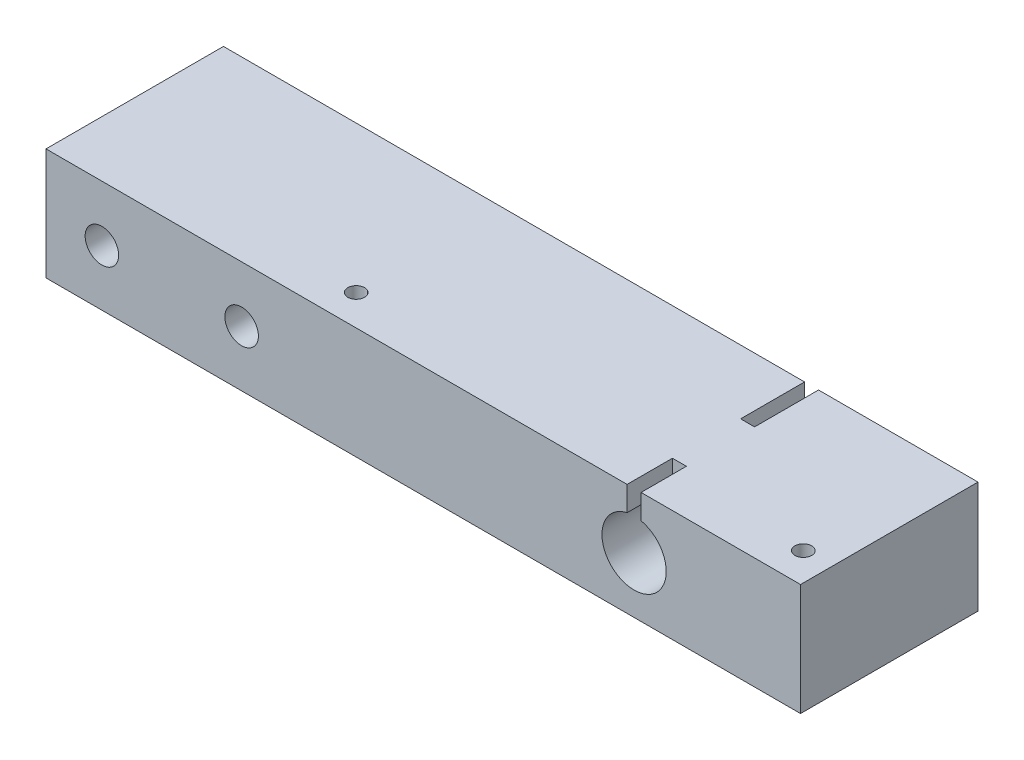
ISO-10303-21;
HEADER;
FILE_DESCRIPTION(('STEP AP214'),'2;1');
FILE_NAME('part.step','',(''),(''),'','','');
FILE_SCHEMA(('AUTOMOTIVE_DESIGN { 1 0 10303 214 1 1 1 1 }'));
ENDSEC;
DATA;
#1=APPLICATION_CONTEXT('core data for automotive mechanical design processes');
#2=APPLICATION_PROTOCOL_DEFINITION('international standard','automotive_design',2000,#1);
#3=PRODUCT_CONTEXT('',#1,'mechanical');
#4=PRODUCT('Part','Part','',(#3));
#5=PRODUCT_RELATED_PRODUCT_CATEGORY('part','',(#4));
#6=PRODUCT_DEFINITION_FORMATION('','',#4);
#7=PRODUCT_DEFINITION_CONTEXT('part definition',#1,'design');
#8=PRODUCT_DEFINITION('design','',#6,#7);
#9=PRODUCT_DEFINITION_SHAPE('','',#8);
#10=(LENGTH_UNIT() NAMED_UNIT(*) SI_UNIT(.MILLI.,.METRE.));
#11=(NAMED_UNIT(*) PLANE_ANGLE_UNIT() SI_UNIT($,.RADIAN.));
#12=(NAMED_UNIT(*) SI_UNIT($,.STERADIAN.) SOLID_ANGLE_UNIT());
#13=UNCERTAINTY_MEASURE_WITH_UNIT(LENGTH_MEASURE(1.E-05),#10,'distance_accuracy_value','');
#14=(GEOMETRIC_REPRESENTATION_CONTEXT(3) GLOBAL_UNCERTAINTY_ASSIGNED_CONTEXT((#13)) GLOBAL_UNIT_ASSIGNED_CONTEXT((#10,
#11,#12)) REPRESENTATION_CONTEXT('',''));
#15=CARTESIAN_POINT('',(0.,0.,0.));
#16=DIRECTION('',(0.,0.,1.));
#17=DIRECTION('',(1.,0.,0.));
#18=AXIS2_PLACEMENT_3D('',#15,#16,#17);
#19=CARTESIAN_POINT('',(42.0877150460028,4.,0.));
#20=DIRECTION('',(0.,0.,1.));
#21=DIRECTION('',(1.,0.,0.));
#22=AXIS2_PLACEMENT_3D('',#19,#20,#21);
#23=CYLINDRICAL_SURFACE('',#22,2.30000000000001);
#24=CARTESIAN_POINT('',(42.0877150460028,4.,0.));
#25=DIRECTION('',(0.,0.,1.));
#26=DIRECTION('',(1.,0.,0.));
#27=AXIS2_PLACEMENT_3D('',#24,#25,#26);
#28=CIRCLE('',#27,2.30000000000001);
#29=CARTESIAN_POINT('',(44.3094541764376,4.59487413483434,0.));
#30=VERTEX_POINT('',#29);
#31=CARTESIAN_POINT('',(42.5877150460028,6.24499443206437,0.));
#32=VERTEX_POINT('',#31);
#33=EDGE_CURVE('E158',#30,#32,#28,.T.);
#34=ORIENTED_EDGE('',*,*,#33,.F.);
#35=DIRECTION('',(0.,0.,-1.));
#36=VECTOR('',#35,1.);
#37=CARTESIAN_POINT('',(44.3094541764376,4.59487413483434,3.));
#38=LINE('',#37,#36);
#39=CARTESIAN_POINT('',(44.3094541764376,4.59487413483434,6.));
#40=VERTEX_POINT('',#39);
#41=EDGE_CURVE('E62',#30,#40,#38,.F.);
#42=ORIENTED_EDGE('',*,*,#41,.T.);
#43=CARTESIAN_POINT('',(42.0877150460028,4.,6.));
#44=DIRECTION('',(0.,0.,-1.));
#45=DIRECTION('',(-1.,0.,0.));
#46=AXIS2_PLACEMENT_3D('',#43,#44,#45);
#47=CIRCLE('',#46,2.30000000000001);
#48=CARTESIAN_POINT('',(44.3094541764376,3.40512586516567,6.));
#49=VERTEX_POINT('',#48);
#50=EDGE_CURVE('E14',#49,#40,#47,.F.);
#51=ORIENTED_EDGE('',*,*,#50,.F.);
#52=DIRECTION('',(0.,0.,-1.));
#53=VECTOR('',#52,1.);
#54=CARTESIAN_POINT('',(44.3094541764376,3.40512586516567,3.));
#55=LINE('',#54,#53);
#56=CARTESIAN_POINT('',(44.3094541764376,3.40512586516567,0.));
#57=VERTEX_POINT('',#56);
#58=EDGE_CURVE('E153',#49,#57,#55,.T.);
#59=ORIENTED_EDGE('',*,*,#58,.T.);
#60=CARTESIAN_POINT('',(41.5877150460028,6.24499443206437,0.));
#61=VERTEX_POINT('',#60);
#62=EDGE_CURVE('E193',#61,#57,#28,.T.);
#63=ORIENTED_EDGE('',*,*,#62,.F.);
#64=DIRECTION('',(0.,0.,1.));
#65=VECTOR('',#64,1.);
#66=CARTESIAN_POINT('',(41.5877150460028,6.24499443206437,0.));
#67=LINE('',#66,#65);
#68=CARTESIAN_POINT('',(41.5877150460028,6.24499443206437,4.57737416325741));
#69=VERTEX_POINT('',#68);
#70=EDGE_CURVE('E55',#69,#61,#67,.F.);
#71=ORIENTED_EDGE('',*,*,#70,.F.);
#72=CARTESIAN_POINT('',(42.0877150460028,4.,4.57737416325741));
#73=DIRECTION('',(0.,0.,1.));
#74=DIRECTION('',(1.,0.,0.));
#75=AXIS2_PLACEMENT_3D('',#72,#73,#74);
#76=CIRCLE('',#75,2.30000000000001);
#77=CARTESIAN_POINT('',(42.5877150460028,6.24499443206437,4.57737416325741));
#78=VERTEX_POINT('',#77);
#79=EDGE_CURVE('E196',#78,#69,#76,.T.);
#80=ORIENTED_EDGE('',*,*,#79,.F.);
#81=DIRECTION('',(0.,0.,1.));
#82=VECTOR('',#81,1.);
#83=CARTESIAN_POINT('',(42.5877150460028,6.24499443206437,0.));
#84=LINE('',#83,#82);
#85=EDGE_CURVE('E200',#32,#78,#84,.T.);
#86=ORIENTED_EDGE('',*,*,#85,.F.);
#87=EDGE_LOOP('',(#34,#42,#51,#59,#63,#71,#80,#86));
#88=FACE_BOUND('',#87,.T.);
#89=CARTESIAN_POINT('',(42.0877150460028,4.,9.45688860373222));
#90=DIRECTION('',(0.,0.,-1.));
#91=DIRECTION('',(-1.,0.,0.));
#92=AXIS2_PLACEMENT_3D('',#89,#90,#91);
#93=CIRCLE('',#92,2.30000000000001);
#94=CARTESIAN_POINT('',(41.5877150460028,6.24499443206437,9.45688860373222));
#95=VERTEX_POINT('',#94);
#96=CARTESIAN_POINT('',(42.5877150460028,6.24499443206437,9.45688860373222));
#97=VERTEX_POINT('',#96);
#98=EDGE_CURVE('E203',#95,#97,#93,.T.);
#99=ORIENTED_EDGE('',*,*,#98,.F.);
#100=DIRECTION('',(0.,0.,1.));
#101=VECTOR('',#100,1.);
#102=CARTESIAN_POINT('',(41.5877150460028,6.24499443206437,0.));
#103=LINE('',#102,#101);
#104=CARTESIAN_POINT('',(41.5877150460028,6.24499443206437,12.7));
#105=VERTEX_POINT('',#104);
#106=EDGE_CURVE('E205',#105,#95,#103,.F.);
#107=ORIENTED_EDGE('',*,*,#106,.F.);
#108=CARTESIAN_POINT('',(42.0877150460028,4.,12.7));
#109=DIRECTION('',(0.,0.,1.));
#110=DIRECTION('',(1.,0.,0.));
#111=AXIS2_PLACEMENT_3D('',#108,#109,#110);
#112=CIRCLE('',#111,2.30000000000001);
#113=CARTESIAN_POINT('',(42.5877150460028,6.24499443206437,12.7));
#114=VERTEX_POINT('',#113);
#115=EDGE_CURVE('E190',#105,#114,#112,.T.);
#116=ORIENTED_EDGE('',*,*,#115,.T.);
#117=DIRECTION('',(0.,0.,1.));
#118=VECTOR('',#117,1.);
#119=CARTESIAN_POINT('',(42.5877150460028,6.24499443206437,0.));
#120=LINE('',#119,#118);
#121=EDGE_CURVE('E70',#97,#114,#120,.T.);
#122=ORIENTED_EDGE('',*,*,#121,.F.);
#123=EDGE_LOOP('',(#99,#107,#116,#122));
#124=FACE_BOUND('',#123,.T.);
#125=CARTESIAN_POINT('',(39.7877150460028,4.,5.72581653929576));
#126=CARTESIAN_POINT('',(39.7877162855899,4.02508629398581,5.72582279978734));
#127=CARTESIAN_POINT('',(39.7881325445039,4.05022364496779,5.72836793099366));
#128=CARTESIAN_POINT('',(39.7897363960611,4.09954785879975,5.73826435373935));
#129=CARTESIAN_POINT('',(39.7909267823017,4.12373094141218,5.74563305275077));
#130=CARTESIAN_POINT('',(39.7938996772061,4.1701369460105,5.7643157614751));
#131=CARTESIAN_POINT('',(39.7956754805926,4.19237861407067,5.77558516300361));
#132=CARTESIAN_POINT('',(39.7996410231373,4.23489123086901,5.80125133077443));
#133=CARTESIAN_POINT('',(39.8018307377943,4.25516229614781,5.81564791191357));
#134=CARTESIAN_POINT('',(39.8077852424093,4.30471866888132,5.85577320402261));
#135=CARTESIAN_POINT('',(39.8117353214633,4.33253973972503,5.88327790078935));
#136=CARTESIAN_POINT('',(39.8197783765346,4.38357743350044,5.94226354737898));
#137=CARTESIAN_POINT('',(39.8238717453278,4.40678000727919,5.9737561667719));
#138=CARTESIAN_POINT('',(39.8338310667002,4.45939387415769,6.05566669542505));
#139=CARTESIAN_POINT('',(39.8395754114095,4.48622226711912,6.10775729449096));
#140=CARTESIAN_POINT('',(39.8498359861978,4.53143988511665,6.21556370106055));
#141=CARTESIAN_POINT('',(39.8543506286079,4.54981822113616,6.27128408110221));
#142=CARTESIAN_POINT('',(39.8616769469037,4.57877797828073,6.38662603478461));
#143=CARTESIAN_POINT('',(39.86443320448,4.58910775154791,6.44631457008756));
#144=CARTESIAN_POINT('',(39.8674896263161,4.60053219705927,6.56661324973427));
#145=CARTESIAN_POINT('',(39.8677928598455,4.60163841004721,6.62722214729077));
#146=CARTESIAN_POINT('',(39.8658353355916,4.5943544973488,6.73496540913839));
#147=CARTESIAN_POINT('',(39.8641030486027,4.58792244075086,6.78223970786499));
#148=CARTESIAN_POINT('',(39.8588873442728,4.56783735809876,6.87513665009807));
#149=CARTESIAN_POINT('',(39.8554065091288,4.55419497846299,6.92076162307937));
#150=CARTESIAN_POINT('',(39.84779432318,4.52245745796409,6.99996569887212));
#151=CARTESIAN_POINT('',(39.8439294858973,4.50578486406861,7.03413748301836));
#152=CARTESIAN_POINT('',(39.8355566125029,4.46709108200244,7.09925749873124));
#153=CARTESIAN_POINT('',(39.8310487622393,4.44507143798552,7.13020665726721));
#154=CARTESIAN_POINT('',(39.8218429782405,4.39555146464547,7.18783280659372));
#155=CARTESIAN_POINT('',(39.8171437803601,4.36800729567373,7.21447233080836));
#156=CARTESIAN_POINT('',(39.8082470815844,4.30811623692065,7.26178920834538));
#157=CARTESIAN_POINT('',(39.804049168617,4.27577334158309,7.2824714787476));
#158=CARTESIAN_POINT('',(39.7973404654628,4.21226098098372,7.31427555657625));
#159=CARTESIAN_POINT('',(39.7946747499716,4.18157706028904,7.32633791681452));
#160=CARTESIAN_POINT('',(39.7905503570113,4.11845327093332,7.34469136155394));
#161=CARTESIAN_POINT('',(39.7890909778033,4.08601443484414,7.35098580154831));
#162=CARTESIAN_POINT('',(39.78764025876,4.0234248066485,7.35723582473369));
#163=CARTESIAN_POINT('',(39.787529969984,3.99332690358558,7.35770507381061));
#164=CARTESIAN_POINT('',(39.788482163398,3.93349904183612,7.35361183025478));
#165=CARTESIAN_POINT('',(39.7895443568899,3.90376899439549,7.34905057627356));
#166=CARTESIAN_POINT('',(39.7926918757135,3.8460901928517,7.33520146583593));
#167=CARTESIAN_POINT('',(39.7947575253575,3.81811841752959,7.32600438290746));
#168=CARTESIAN_POINT('',(39.7996852337742,3.76408371685562,7.30326344200064));
#169=CARTESIAN_POINT('',(39.802547338735,3.73802090231918,7.28971933192203));
#170=CARTESIAN_POINT('',(39.8088877653461,3.68756591132078,7.25823624598122));
#171=CARTESIAN_POINT('',(39.8123833921273,3.66325793919821,7.24016627743284));
#172=CARTESIAN_POINT('',(39.8195838688575,3.61775283628073,7.20051032743243));
#173=CARTESIAN_POINT('',(39.8232887697235,3.5965564671018,7.17892348788723));
#174=CARTESIAN_POINT('',(39.8309231931538,3.55574658833778,7.13081903142971));
#175=CARTESIAN_POINT('',(39.8348427076681,3.53644983691396,7.10403199857646));
#176=CARTESIAN_POINT('',(39.8422292019668,3.50189863426814,7.04792096364256));
#177=CARTESIAN_POINT('',(39.845695891298,3.48664677113791,7.01859535311003));
#178=CARTESIAN_POINT('',(39.8533027152238,3.45429676611324,6.94504135529167));
#179=CARTESIAN_POINT('',(39.8570834270623,3.43926390589301,6.89986306723876));
#180=CARTESIAN_POINT('',(39.862920582599,3.41654274953689,6.80758763786805));
#181=CARTESIAN_POINT('',(39.8649736700522,3.40886874538758,6.76048694708058));
#182=CARTESIAN_POINT('',(39.8676615922823,3.39883144753603,6.65198544324381));
#183=CARTESIAN_POINT('',(39.8677179052945,3.39863330437833,6.59037179866455));
#184=CARTESIAN_POINT('',(39.865241107821,3.40786315975168,6.46788380951049));
#185=CARTESIAN_POINT('',(39.8627033235782,3.41730853286575,6.4070109999863));
#186=CARTESIAN_POINT('',(39.8555230995332,3.44544235898438,6.28662754440284));
#187=CARTESIAN_POINT('',(39.8508502083587,3.46426491504867,6.22715017142419));
#188=CARTESIAN_POINT('',(39.8400800295888,3.51140066072197,6.1122554931561));
#189=CARTESIAN_POINT('',(39.8339865087437,3.53968883743115,6.05682795163829));
#190=CARTESIAN_POINT('',(39.8240451524043,3.59236059374266,5.97525266066045));
#191=CARTESIAN_POINT('',(39.8203601735757,3.61318033175742,5.94677426919114));
#192=CARTESIAN_POINT('',(39.8130802249362,3.65858232913248,5.89295555621097));
#193=CARTESIAN_POINT('',(39.8094851387696,3.68315939668128,5.867610990533));
#194=CARTESIAN_POINT('',(39.8034862608837,3.73031867522132,5.82665771208088));
#195=CARTESIAN_POINT('',(39.8009968187162,3.75209727756587,5.81014303497407));
#196=CARTESIAN_POINT('',(39.7964825486701,3.79805033611929,5.78073712275357));
#197=CARTESIAN_POINT('',(39.7944572197807,3.82222216806605,5.76784197693561));
#198=CARTESIAN_POINT('',(39.7914332401044,3.86769757402165,5.74880152699347));
#199=CARTESIAN_POINT('',(39.790311574187,3.88864610011863,5.74183160485069));
#200=CARTESIAN_POINT('',(39.7886395295743,3.93140686423272,5.73148623213697));
#201=CARTESIAN_POINT('',(39.7880874470543,3.95321632247573,5.72810006051579));
#202=CARTESIAN_POINT('',(39.7877596591905,3.98340512358933,5.72609033464018));
#203=CARTESIAN_POINT('',(39.787714635864,3.99169976711004,5.72581446790419));
#204=CARTESIAN_POINT('',(39.7877150460028,4.,5.72581653929576));
#205=B_SPLINE_CURVE_WITH_KNOTS('',3,(#125,#126,#127,#128,#129,#130,#131,#132,#133,#134,#135,
#136,#137,#138,#139,#140,#141,#142,#143,#144,#145,#146,#147,#148,#149,#150,#151,#152,#153,#154,
#155,#156,#157,#158,#159,#160,#161,#162,#163,#164,#165,#166,#167,#168,#169,#170,#171,#172,#173,
#174,#175,#176,#177,#178,#179,#180,#181,#182,#183,#184,#185,#186,#187,#188,#189,#190,#191,#192,
#193,#194,#195,#196,#197,#198,#199,#200,#201,#202,#203,#204),.UNSPECIFIED.,.T.,.F.,(4,2,2,2,2,2,
2,2,2,2,2,2,2,2,2,2,2,2,2,2,2,2,2,2,2,2,2,2,2,2,2,2,2,2,2,2,2,2,2,4),(0.,0.0752248706366504,
0.150722723446018,0.225384252748308,0.300041363909166,0.417339146731649,0.534988464456169,
0.710670196240293,0.886577687022113,1.06778611301152,1.24876777251789,1.39149031598692,
1.53400270850422,1.6482100264315,1.76238440201397,1.87750345421266,1.99252721378591,
2.0912174631665,2.18985026288172,2.27971672685822,2.36956106811951,2.4577108099523,
2.54586566484025,2.63694756359734,2.72805171910766,2.82739921710275,2.9268101293275,
3.06931112003878,3.21208831155527,3.39597291069119,3.58018939768473,3.76711943222376,
3.95355935461815,4.05971760532868,4.1657304725796,4.24779434556344,4.32976920872548,
4.39581882387843,4.46167028340355,4.48655972884156),.UNSPECIFIED.);
#206=CARTESIAN_POINT('',(39.7877150460028,4.,5.72581653929576));
#207=VERTEX_POINT('',#206);
#208=EDGE_CURVE('E159',#207,#207,#205,.T.);
#209=ORIENTED_EDGE('',*,*,#208,.F.);
#210=EDGE_LOOP('',(#209));
#211=FACE_BOUND('',#210,.T.);
#212=ADVANCED_FACE('F47',(#88,#124,#211),#23,.F.);
#213=CARTESIAN_POINT('',(0.,0.,12.7));
#214=DIRECTION('',(1.,0.,0.));
#215=DIRECTION('',(0.,0.,-1.));
#216=AXIS2_PLACEMENT_3D('',#213,#214,#215);
#217=PLANE('',#216);
#218=DIRECTION('',(0.,-1.,0.));
#219=VECTOR('',#218,1.);
#220=CARTESIAN_POINT('',(0.,0.,0.));
#221=LINE('',#220,#219);
#222=CARTESIAN_POINT('',(0.,8.,0.));
#223=VERTEX_POINT('',#222);
#224=CARTESIAN_POINT('',(0.,0.,0.));
#225=VERTEX_POINT('',#224);
#226=EDGE_CURVE('E238',#223,#225,#221,.T.);
#227=ORIENTED_EDGE('',*,*,#226,.T.);
#228=DIRECTION('',(0.,0.,-1.));
#229=VECTOR('',#228,1.);
#230=CARTESIAN_POINT('',(0.,0.,12.7));
#231=LINE('',#230,#229);
#232=CARTESIAN_POINT('',(0.,0.,12.7));
#233=VERTEX_POINT('',#232);
#234=EDGE_CURVE('E274',#233,#225,#231,.T.);
#235=ORIENTED_EDGE('',*,*,#234,.F.);
#236=DIRECTION('',(0.,-1.,0.));
#237=VECTOR('',#236,1.);
#238=CARTESIAN_POINT('',(0.,0.,12.7));
#239=LINE('',#238,#237);
#240=CARTESIAN_POINT('',(0.,8.,12.7));
#241=VERTEX_POINT('',#240);
#242=EDGE_CURVE('E244',#241,#233,#239,.T.);
#243=ORIENTED_EDGE('',*,*,#242,.F.);
#244=DIRECTION('',(0.,0.,-1.));
#245=VECTOR('',#244,1.);
#246=CARTESIAN_POINT('',(0.,8.,12.7));
#247=LINE('',#246,#245);
#248=EDGE_CURVE('E256',#241,#223,#247,.T.);
#249=ORIENTED_EDGE('',*,*,#248,.T.);
#250=EDGE_LOOP('',(#227,#235,#243,#249));
#251=FACE_BOUND('',#250,.T.);
#252=ADVANCED_FACE('F49',(#251),#217,.F.);
#253=CARTESIAN_POINT('',(0.,0.,12.7));
#254=DIRECTION('',(0.,1.,0.));
#255=DIRECTION('',(0.,0.,1.));
#256=AXIS2_PLACEMENT_3D('',#253,#254,#255);
#257=PLANE('',#256);
#258=CARTESIAN_POINT('',(20.,0.,10.5));
#259=DIRECTION('',(0.,1.,0.));
#260=DIRECTION('',(0.,0.,1.));
#261=AXIS2_PLACEMENT_3D('',#258,#259,#260);
#262=CIRCLE('',#261,0.6);
#263=CARTESIAN_POINT('',(20.,0.,11.1));
#264=VERTEX_POINT('',#263);
#265=EDGE_CURVE('E181',#264,#264,#262,.T.);
#266=ORIENTED_EDGE('',*,*,#265,.T.);
#267=EDGE_LOOP('',(#266));
#268=FACE_BOUND('',#267,.T.);
#269=CARTESIAN_POINT('',(52.,0.,10.5));
#270=DIRECTION('',(0.,1.,0.));
#271=DIRECTION('',(0.,0.,1.));
#272=AXIS2_PLACEMENT_3D('',#269,#270,#271);
#273=CIRCLE('',#272,0.600000000000001);
#274=CARTESIAN_POINT('',(52.,0.,11.1));
#275=VERTEX_POINT('',#274);
#276=EDGE_CURVE('E187',#275,#275,#273,.T.);
#277=ORIENTED_EDGE('',*,*,#276,.T.);
#278=EDGE_LOOP('',(#277));
#279=FACE_BOUND('',#278,.T.);
#280=DIRECTION('',(1.,0.,0.));
#281=VECTOR('',#280,1.);
#282=CARTESIAN_POINT('',(0.,0.,0.));
#283=LINE('',#282,#281);
#284=CARTESIAN_POINT('',(54.,0.,0.));
#285=VERTEX_POINT('',#284);
#286=EDGE_CURVE('E259',#225,#285,#283,.T.);
#287=ORIENTED_EDGE('',*,*,#286,.T.);
#288=DIRECTION('',(0.,0.,-1.));
#289=VECTOR('',#288,1.);
#290=CARTESIAN_POINT('',(54.,0.,12.7));
#291=LINE('',#290,#289);
#292=CARTESIAN_POINT('',(54.,0.,12.7));
#293=VERTEX_POINT('',#292);
#294=EDGE_CURVE('E271',#293,#285,#291,.T.);
#295=ORIENTED_EDGE('',*,*,#294,.F.);
#296=DIRECTION('',(1.,0.,0.));
#297=VECTOR('',#296,1.);
#298=CARTESIAN_POINT('',(0.,0.,12.7));
#299=LINE('',#298,#297);
#300=EDGE_CURVE('E247',#233,#293,#299,.T.);
#301=ORIENTED_EDGE('',*,*,#300,.F.);
#302=ORIENTED_EDGE('',*,*,#234,.T.);
#303=EDGE_LOOP('',(#287,#295,#301,#302));
#304=FACE_BOUND('',#303,.T.);
#305=ADVANCED_FACE('F319',(#268,#279,#304),#257,.F.);
#306=CARTESIAN_POINT('',(54.,0.,12.7));
#307=DIRECTION('',(-1.,0.,0.));
#308=DIRECTION('',(0.,0.,1.));
#309=AXIS2_PLACEMENT_3D('',#306,#307,#308);
#310=PLANE('',#309);
#311=DIRECTION('',(0.,1.,0.));
#312=VECTOR('',#311,1.);
#313=CARTESIAN_POINT('',(54.,0.,0.));
#314=LINE('',#313,#312);
#315=CARTESIAN_POINT('',(54.,8.,0.));
#316=VERTEX_POINT('',#315);
#317=EDGE_CURVE('E261',#285,#316,#314,.T.);
#318=ORIENTED_EDGE('',*,*,#317,.T.);
#319=DIRECTION('',(0.,0.,-1.));
#320=VECTOR('',#319,1.);
#321=CARTESIAN_POINT('',(54.,8.,12.7));
#322=LINE('',#321,#320);
#323=CARTESIAN_POINT('',(54.,8.,12.7));
#324=VERTEX_POINT('',#323);
#325=EDGE_CURVE('E268',#324,#316,#322,.T.);
#326=ORIENTED_EDGE('',*,*,#325,.F.);
#327=DIRECTION('',(0.,1.,0.));
#328=VECTOR('',#327,1.);
#329=CARTESIAN_POINT('',(54.,0.,12.7));
#330=LINE('',#329,#328);
#331=EDGE_CURVE('E250',#293,#324,#330,.T.);
#332=ORIENTED_EDGE('',*,*,#331,.F.);
#333=ORIENTED_EDGE('',*,*,#294,.T.);
#334=EDGE_LOOP('',(#318,#326,#332,#333));
#335=FACE_BOUND('',#334,.T.);
#336=ADVANCED_FACE('F324',(#335),#310,.F.);
#337=CARTESIAN_POINT('',(0.,8.,12.7));
#338=DIRECTION('',(0.,-1.,0.));
#339=DIRECTION('',(0.,0.,-1.));
#340=AXIS2_PLACEMENT_3D('',#337,#338,#339);
#341=PLANE('',#340);
#342=CARTESIAN_POINT('',(20.,8.,10.5));
#343=DIRECTION('',(0.,1.,0.));
#344=DIRECTION('',(0.,0.,1.));
#345=AXIS2_PLACEMENT_3D('',#342,#343,#344);
#346=CIRCLE('',#345,0.6);
#347=CARTESIAN_POINT('',(20.,8.,11.1));
#348=VERTEX_POINT('',#347);
#349=EDGE_CURVE('E178',#348,#348,#346,.T.);
#350=ORIENTED_EDGE('',*,*,#349,.F.);
#351=EDGE_LOOP('',(#350));
#352=FACE_BOUND('',#351,.T.);
#353=CARTESIAN_POINT('',(52.,8.,10.5));
#354=DIRECTION('',(0.,1.,0.));
#355=DIRECTION('',(0.,0.,1.));
#356=AXIS2_PLACEMENT_3D('',#353,#354,#355);
#357=CIRCLE('',#356,0.600000000000001);
#358=CARTESIAN_POINT('',(52.,8.,11.1));
#359=VERTEX_POINT('',#358);
#360=EDGE_CURVE('E184',#359,#359,#357,.T.);
#361=ORIENTED_EDGE('',*,*,#360,.F.);
#362=EDGE_LOOP('',(#361));
#363=FACE_BOUND('',#362,.T.);
#364=DIRECTION('',(-1.,0.,0.));
#365=VECTOR('',#364,1.);
#366=CARTESIAN_POINT('',(0.,8.,0.));
#367=LINE('',#366,#365);
#368=CARTESIAN_POINT('',(42.5877150460028,8.,0.));
#369=VERTEX_POINT('',#368);
#370=EDGE_CURVE('E248',#316,#369,#367,.T.);
#371=ORIENTED_EDGE('',*,*,#370,.T.);
#372=DIRECTION('',(0.,0.,-1.));
#373=VECTOR('',#372,1.);
#374=CARTESIAN_POINT('',(42.5877150460028,8.,0.));
#375=LINE('',#374,#373);
#376=CARTESIAN_POINT('',(42.5877150460028,8.,4.57737416325741));
#377=VERTEX_POINT('',#376);
#378=EDGE_CURVE('E209',#377,#369,#375,.T.);
#379=ORIENTED_EDGE('',*,*,#378,.F.);
#380=DIRECTION('',(1.,0.,0.));
#381=VECTOR('',#380,1.);
#382=CARTESIAN_POINT('',(42.5877150460028,8.,4.57737416325741));
#383=LINE('',#382,#381);
#384=CARTESIAN_POINT('',(41.5877150460028,8.,4.57737416325741));
#385=VERTEX_POINT('',#384);
#386=EDGE_CURVE('E215',#385,#377,#383,.T.);
#387=ORIENTED_EDGE('',*,*,#386,.F.);
#388=DIRECTION('',(0.,0.,1.));
#389=VECTOR('',#388,1.);
#390=CARTESIAN_POINT('',(41.5877150460028,8.,0.));
#391=LINE('',#390,#389);
#392=CARTESIAN_POINT('',(41.5877150460028,8.,0.));
#393=VERTEX_POINT('',#392);
#394=EDGE_CURVE('E212',#393,#385,#391,.T.);
#395=ORIENTED_EDGE('',*,*,#394,.F.);
#396=EDGE_CURVE('E263',#393,#223,#367,.T.);
#397=ORIENTED_EDGE('',*,*,#396,.T.);
#398=ORIENTED_EDGE('',*,*,#248,.F.);
#399=DIRECTION('',(-1.,0.,0.));
#400=VECTOR('',#399,1.);
#401=CARTESIAN_POINT('',(0.,8.,12.7));
#402=LINE('',#401,#400);
#403=CARTESIAN_POINT('',(41.5877150460028,8.,12.7));
#404=VERTEX_POINT('',#403);
#405=EDGE_CURVE('E252',#404,#241,#402,.T.);
#406=ORIENTED_EDGE('',*,*,#405,.F.);
#407=DIRECTION('',(0.,0.,1.));
#408=VECTOR('',#407,1.);
#409=CARTESIAN_POINT('',(41.5877150460028,8.,12.7));
#410=LINE('',#409,#408);
#411=CARTESIAN_POINT('',(41.5877150460028,8.,9.45688860373222));
#412=VERTEX_POINT('',#411);
#413=EDGE_CURVE('E232',#412,#404,#410,.T.);
#414=ORIENTED_EDGE('',*,*,#413,.F.);
#415=DIRECTION('',(-1.,0.,0.));
#416=VECTOR('',#415,1.);
#417=CARTESIAN_POINT('',(42.5877150460028,8.,9.45688860373222));
#418=LINE('',#417,#416);
#419=CARTESIAN_POINT('',(42.5877150460028,8.,9.45688860373222));
#420=VERTEX_POINT('',#419);
#421=EDGE_CURVE('E229',#420,#412,#418,.T.);
#422=ORIENTED_EDGE('',*,*,#421,.F.);
#423=DIRECTION('',(0.,0.,-1.));
#424=VECTOR('',#423,1.);
#425=CARTESIAN_POINT('',(42.5877150460028,8.,12.7));
#426=LINE('',#425,#424);
#427=CARTESIAN_POINT('',(42.5877150460028,8.,12.7));
#428=VERTEX_POINT('',#427);
#429=EDGE_CURVE('E221',#428,#420,#426,.T.);
#430=ORIENTED_EDGE('',*,*,#429,.F.);
#431=EDGE_CURVE('E253',#324,#428,#402,.T.);
#432=ORIENTED_EDGE('',*,*,#431,.F.);
#433=ORIENTED_EDGE('',*,*,#325,.T.);
#434=EDGE_LOOP('',(#371,#379,#387,#395,#397,#398,#406,#414,#422,#430,#432,#433));
#435=FACE_BOUND('',#434,.T.);
#436=ADVANCED_FACE('F348',(#352,#363,#435),#341,.F.);
#437=CARTESIAN_POINT('',(0.,0.,12.7));
#438=DIRECTION('',(0.,0.,-1.));
#439=DIRECTION('',(-1.,0.,0.));
#440=AXIS2_PLACEMENT_3D('',#437,#438,#439);
#441=PLANE('',#440);
#442=CARTESIAN_POINT('',(14.,4.,12.7));
#443=DIRECTION('',(0.,0.,1.));
#444=DIRECTION('',(1.,0.,0.));
#445=AXIS2_PLACEMENT_3D('',#442,#443,#444);
#446=CIRCLE('',#445,1.2);
#447=CARTESIAN_POINT('',(15.2,4.,12.7));
#448=VERTEX_POINT('',#447);
#449=EDGE_CURVE('E168',#448,#448,#446,.T.);
#450=ORIENTED_EDGE('',*,*,#449,.F.);
#451=EDGE_LOOP('',(#450));
#452=FACE_BOUND('',#451,.T.);
#453=CARTESIAN_POINT('',(4.,4.,12.7));
#454=DIRECTION('',(0.,0.,1.));
#455=DIRECTION('',(1.,0.,0.));
#456=AXIS2_PLACEMENT_3D('',#453,#454,#455);
#457=CIRCLE('',#456,1.2);
#458=CARTESIAN_POINT('',(5.2,4.,12.7));
#459=VERTEX_POINT('',#458);
#460=EDGE_CURVE('E172',#459,#459,#457,.T.);
#461=ORIENTED_EDGE('',*,*,#460,.F.);
#462=EDGE_LOOP('',(#461));
#463=FACE_BOUND('',#462,.T.);
#464=DIRECTION('',(0.,1.,0.));
#465=VECTOR('',#464,1.);
#466=CARTESIAN_POINT('',(42.5877150460028,6.,12.7));
#467=LINE('',#466,#465);
#468=EDGE_CURVE('E236',#114,#428,#467,.T.);
#469=ORIENTED_EDGE('',*,*,#468,.F.);
#470=ORIENTED_EDGE('',*,*,#115,.F.);
#471=DIRECTION('',(0.,1.,0.));
#472=VECTOR('',#471,1.);
#473=CARTESIAN_POINT('',(41.5877150460028,6.,12.7));
#474=LINE('',#473,#472);
#475=EDGE_CURVE('E239',#105,#404,#474,.T.);
#476=ORIENTED_EDGE('',*,*,#475,.T.);
#477=ORIENTED_EDGE('',*,*,#405,.T.);
#478=ORIENTED_EDGE('',*,*,#242,.T.);
#479=ORIENTED_EDGE('',*,*,#300,.T.);
#480=ORIENTED_EDGE('',*,*,#331,.T.);
#481=ORIENTED_EDGE('',*,*,#431,.T.);
#482=EDGE_LOOP('',(#469,#470,#476,#477,#478,#479,#480,#481));
#483=FACE_BOUND('',#482,.T.);
#484=ADVANCED_FACE('F342',(#452,#463,#483),#441,.F.);
#485=CARTESIAN_POINT('',(0.,0.,0.));
#486=DIRECTION('',(0.,0.,-1.));
#487=DIRECTION('',(-1.,0.,0.));
#488=AXIS2_PLACEMENT_3D('',#485,#486,#487);
#489=PLANE('',#488);
#490=CARTESIAN_POINT('',(44.3877150460028,4.,0.));
#491=DIRECTION('',(0.,0.,-1.));
#492=DIRECTION('',(-1.,0.,0.));
#493=AXIS2_PLACEMENT_3D('',#490,#491,#492);
#494=CIRCLE('',#493,0.6);
#495=EDGE_CURVE('E154',#30,#57,#494,.T.);
#496=ORIENTED_EDGE('',*,*,#495,.F.);
#497=ORIENTED_EDGE('',*,*,#33,.T.);
#498=DIRECTION('',(0.,1.,0.));
#499=VECTOR('',#498,1.);
#500=CARTESIAN_POINT('',(42.5877150460028,6.,0.));
#501=LINE('',#500,#499);
#502=EDGE_CURVE('E218',#32,#369,#501,.T.);
#503=ORIENTED_EDGE('',*,*,#502,.T.);
#504=ORIENTED_EDGE('',*,*,#370,.F.);
#505=ORIENTED_EDGE('',*,*,#317,.F.);
#506=ORIENTED_EDGE('',*,*,#286,.F.);
#507=ORIENTED_EDGE('',*,*,#226,.F.);
#508=ORIENTED_EDGE('',*,*,#396,.F.);
#509=DIRECTION('',(0.,1.,0.));
#510=VECTOR('',#509,1.);
#511=CARTESIAN_POINT('',(41.5877150460028,6.,0.));
#512=LINE('',#511,#510);
#513=EDGE_CURVE('E224',#61,#393,#512,.T.);
#514=ORIENTED_EDGE('',*,*,#513,.F.);
#515=ORIENTED_EDGE('',*,*,#62,.T.);
#516=EDGE_LOOP('',(#496,#497,#503,#504,#505,#506,#507,#508,#514,#515));
#517=FACE_BOUND('',#516,.T.);
#518=CARTESIAN_POINT('',(32.6823289381033,4.,0.));
#519=DIRECTION('',(0.,0.,-1.));
#520=DIRECTION('',(1.,0.,0.));
#521=AXIS2_PLACEMENT_3D('',#518,#519,#520);
#522=ELLIPSE('',#521,0.885865613507276,0.600000000000001);
#523=CARTESIAN_POINT('',(33.5681945516106,4.,0.));
#524=VERTEX_POINT('',#523);
#525=EDGE_CURVE('E162',#524,#524,#522,.F.);
#526=ORIENTED_EDGE('',*,*,#525,.T.);
#527=EDGE_LOOP('',(#526));
#528=FACE_BOUND('',#527,.T.);
#529=CARTESIAN_POINT('',(14.,4.,0.));
#530=DIRECTION('',(0.,0.,1.));
#531=DIRECTION('',(1.,0.,0.));
#532=AXIS2_PLACEMENT_3D('',#529,#530,#531);
#533=CIRCLE('',#532,1.2);
#534=CARTESIAN_POINT('',(15.2,4.,0.));
#535=VERTEX_POINT('',#534);
#536=EDGE_CURVE('E169',#535,#535,#533,.T.);
#537=ORIENTED_EDGE('',*,*,#536,.T.);
#538=EDGE_LOOP('',(#537));
#539=FACE_BOUND('',#538,.T.);
#540=CARTESIAN_POINT('',(4.,4.,0.));
#541=DIRECTION('',(0.,0.,1.));
#542=DIRECTION('',(1.,0.,0.));
#543=AXIS2_PLACEMENT_3D('',#540,#541,#542);
#544=CIRCLE('',#543,1.2);
#545=CARTESIAN_POINT('',(5.2,4.,0.));
#546=VERTEX_POINT('',#545);
#547=EDGE_CURVE('E175',#546,#546,#544,.T.);
#548=ORIENTED_EDGE('',*,*,#547,.T.);
#549=EDGE_LOOP('',(#548));
#550=FACE_BOUND('',#549,.T.);
#551=ADVANCED_FACE('F332',(#517,#528,#539,#550),#489,.T.);
#552=CARTESIAN_POINT('',(42.5877150460028,6.,12.7));
#553=DIRECTION('',(1.,0.,0.));
#554=DIRECTION('',(0.,0.,-1.));
#555=AXIS2_PLACEMENT_3D('',#552,#553,#554);
#556=PLANE('',#555);
#557=DIRECTION('',(0.,1.,0.));
#558=VECTOR('',#557,1.);
#559=CARTESIAN_POINT('',(42.5877150460028,6.,9.45688860373222));
#560=LINE('',#559,#558);
#561=EDGE_CURVE('E235',#97,#420,#560,.T.);
#562=ORIENTED_EDGE('',*,*,#561,.F.);
#563=ORIENTED_EDGE('',*,*,#121,.T.);
#564=ORIENTED_EDGE('',*,*,#468,.T.);
#565=ORIENTED_EDGE('',*,*,#429,.T.);
#566=EDGE_LOOP('',(#562,#563,#564,#565));
#567=FACE_BOUND('',#566,.T.);
#568=ADVANCED_FACE('F364',(#567),#556,.F.);
#569=CARTESIAN_POINT('',(41.5877150460028,6.,12.7));
#570=DIRECTION('',(-1.,0.,0.));
#571=DIRECTION('',(0.,0.,1.));
#572=AXIS2_PLACEMENT_3D('',#569,#570,#571);
#573=PLANE('',#572);
#574=ORIENTED_EDGE('',*,*,#475,.F.);
#575=ORIENTED_EDGE('',*,*,#106,.T.);
#576=DIRECTION('',(0.,1.,0.));
#577=VECTOR('',#576,1.);
#578=CARTESIAN_POINT('',(41.5877150460028,6.,9.45688860373222));
#579=LINE('',#578,#577);
#580=EDGE_CURVE('E241',#95,#412,#579,.T.);
#581=ORIENTED_EDGE('',*,*,#580,.T.);
#582=ORIENTED_EDGE('',*,*,#413,.T.);
#583=EDGE_LOOP('',(#574,#575,#581,#582));
#584=FACE_BOUND('',#583,.T.);
#585=ADVANCED_FACE('F371',(#584),#573,.F.);
#586=CARTESIAN_POINT('',(42.5877150460028,6.,9.45688860373222));
#587=DIRECTION('',(0.,0.,-1.));
#588=DIRECTION('',(-1.,0.,0.));
#589=AXIS2_PLACEMENT_3D('',#586,#587,#588);
#590=PLANE('',#589);
#591=ORIENTED_EDGE('',*,*,#580,.F.);
#592=ORIENTED_EDGE('',*,*,#98,.T.);
#593=ORIENTED_EDGE('',*,*,#561,.T.);
#594=ORIENTED_EDGE('',*,*,#421,.T.);
#595=EDGE_LOOP('',(#591,#592,#593,#594));
#596=FACE_BOUND('',#595,.T.);
#597=ADVANCED_FACE('F368',(#596),#590,.F.);
#598=CARTESIAN_POINT('',(42.5877150460028,6.,0.));
#599=DIRECTION('',(1.,0.,0.));
#600=DIRECTION('',(0.,0.,-1.));
#601=AXIS2_PLACEMENT_3D('',#598,#599,#600);
#602=PLANE('',#601);
#603=ORIENTED_EDGE('',*,*,#502,.F.);
#604=ORIENTED_EDGE('',*,*,#85,.T.);
#605=DIRECTION('',(0.,1.,0.));
#606=VECTOR('',#605,1.);
#607=CARTESIAN_POINT('',(42.5877150460028,6.,4.57737416325741));
#608=LINE('',#607,#606);
#609=EDGE_CURVE('E219',#78,#377,#608,.T.);
#610=ORIENTED_EDGE('',*,*,#609,.T.);
#611=ORIENTED_EDGE('',*,*,#378,.T.);
#612=EDGE_LOOP('',(#603,#604,#610,#611));
#613=FACE_BOUND('',#612,.T.);
#614=ADVANCED_FACE('F357',(#613),#602,.F.);
#615=CARTESIAN_POINT('',(42.5877150460028,6.,4.57737416325741));
#616=DIRECTION('',(0.,0.,1.));
#617=DIRECTION('',(1.,0.,0.));
#618=AXIS2_PLACEMENT_3D('',#615,#616,#617);
#619=PLANE('',#618);
#620=ORIENTED_EDGE('',*,*,#609,.F.);
#621=ORIENTED_EDGE('',*,*,#79,.T.);
#622=DIRECTION('',(0.,1.,0.));
#623=VECTOR('',#622,1.);
#624=CARTESIAN_POINT('',(41.5877150460028,6.,4.57737416325741));
#625=LINE('',#624,#623);
#626=EDGE_CURVE('E222',#69,#385,#625,.T.);
#627=ORIENTED_EDGE('',*,*,#626,.T.);
#628=ORIENTED_EDGE('',*,*,#386,.T.);
#629=EDGE_LOOP('',(#620,#621,#627,#628));
#630=FACE_BOUND('',#629,.T.);
#631=ADVANCED_FACE('F310',(#630),#619,.F.);
#632=CARTESIAN_POINT('',(41.5877150460028,6.,0.));
#633=DIRECTION('',(-1.,0.,0.));
#634=DIRECTION('',(0.,0.,1.));
#635=AXIS2_PLACEMENT_3D('',#632,#633,#634);
#636=PLANE('',#635);
#637=ORIENTED_EDGE('',*,*,#626,.F.);
#638=ORIENTED_EDGE('',*,*,#70,.T.);
#639=ORIENTED_EDGE('',*,*,#513,.T.);
#640=ORIENTED_EDGE('',*,*,#394,.T.);
#641=EDGE_LOOP('',(#637,#638,#639,#640));
#642=FACE_BOUND('',#641,.T.);
#643=ADVANCED_FACE('F305',(#642),#636,.F.);
#644=CARTESIAN_POINT('',(52.,0.,10.5));
#645=DIRECTION('',(0.,1.,0.));
#646=DIRECTION('',(0.,0.,1.));
#647=AXIS2_PLACEMENT_3D('',#644,#645,#646);
#648=CYLINDRICAL_SURFACE('',#647,0.600000000000001);
#649=ORIENTED_EDGE('',*,*,#276,.F.);
#650=EDGE_LOOP('',(#649));
#651=FACE_BOUND('',#650,.T.);
#652=ORIENTED_EDGE('',*,*,#360,.T.);
#653=EDGE_LOOP('',(#652));
#654=FACE_BOUND('',#653,.T.);
#655=ADVANCED_FACE('F302',(#651,#654),#648,.F.);
#656=CARTESIAN_POINT('',(20.,0.,10.5));
#657=DIRECTION('',(0.,1.,0.));
#658=DIRECTION('',(0.,0.,1.));
#659=AXIS2_PLACEMENT_3D('',#656,#657,#658);
#660=CYLINDRICAL_SURFACE('',#659,0.6);
#661=ORIENTED_EDGE('',*,*,#265,.F.);
#662=EDGE_LOOP('',(#661));
#663=FACE_BOUND('',#662,.T.);
#664=ORIENTED_EDGE('',*,*,#349,.T.);
#665=EDGE_LOOP('',(#664));
#666=FACE_BOUND('',#665,.T.);
#667=ADVANCED_FACE('F299',(#663,#666),#660,.F.);
#668=CARTESIAN_POINT('',(4.,4.,0.));
#669=DIRECTION('',(0.,0.,1.));
#670=DIRECTION('',(1.,0.,0.));
#671=AXIS2_PLACEMENT_3D('',#668,#669,#670);
#672=CYLINDRICAL_SURFACE('',#671,1.2);
#673=ORIENTED_EDGE('',*,*,#547,.F.);
#674=EDGE_LOOP('',(#673));
#675=FACE_BOUND('',#674,.T.);
#676=ORIENTED_EDGE('',*,*,#460,.T.);
#677=EDGE_LOOP('',(#676));
#678=FACE_BOUND('',#677,.T.);
#679=ADVANCED_FACE('F295',(#675,#678),#672,.F.);
#680=CARTESIAN_POINT('',(14.,4.,0.));
#681=DIRECTION('',(0.,0.,1.));
#682=DIRECTION('',(1.,0.,0.));
#683=AXIS2_PLACEMENT_3D('',#680,#681,#682);
#684=CYLINDRICAL_SURFACE('',#683,1.2);
#685=ORIENTED_EDGE('',*,*,#536,.F.);
#686=EDGE_LOOP('',(#685));
#687=FACE_BOUND('',#686,.T.);
#688=ORIENTED_EDGE('',*,*,#449,.T.);
#689=EDGE_LOOP('',(#688));
#690=FACE_BOUND('',#689,.T.);
#691=ADVANCED_FACE('F290',(#687,#690),#684,.F.);
#692=CARTESIAN_POINT('',(29.9017037057734,4.,-2.55989990855614));
#693=DIRECTION('',(0.73570359945098,0.,0.677303634830695));
#694=DIRECTION('',(0.677303634830695,0.,-0.735703599450981));
#695=AXIS2_PLACEMENT_3D('',#692,#693,#694);
#696=CYLINDRICAL_SURFACE('',#695,0.600000000000001);
#697=ORIENTED_EDGE('',*,*,#525,.F.);
#698=EDGE_LOOP('',(#697));
#699=FACE_BOUND('',#698,.T.);
#700=ORIENTED_EDGE('',*,*,#208,.T.);
#701=EDGE_LOOP('',(#700));
#702=FACE_BOUND('',#701,.T.);
#703=ADVANCED_FACE('F285',(#699,#702),#696,.F.);
#704=CARTESIAN_POINT('',(44.3877150460028,4.,6.));
#705=DIRECTION('',(0.,0.,-1.));
#706=DIRECTION('',(-1.,0.,0.));
#707=AXIS2_PLACEMENT_3D('',#704,#705,#706);
#708=PLANE('',#707);
#709=ORIENTED_EDGE('',*,*,#50,.T.);
#710=CARTESIAN_POINT('',(44.3877150460028,4.,6.));
#711=DIRECTION('',(0.,0.,-1.));
#712=DIRECTION('',(-1.,0.,0.));
#713=AXIS2_PLACEMENT_3D('',#710,#711,#712);
#714=CIRCLE('',#713,0.6);
#715=EDGE_CURVE('E149',#40,#49,#714,.T.);
#716=ORIENTED_EDGE('',*,*,#715,.T.);
#717=EDGE_LOOP('',(#709,#716));
#718=FACE_BOUND('',#717,.T.);
#719=ADVANCED_FACE('F148',(#718),#708,.T.);
#720=CARTESIAN_POINT('',(44.3877150460028,4.,6.));
#721=DIRECTION('',(0.,0.,-1.));
#722=DIRECTION('',(-1.,0.,0.));
#723=AXIS2_PLACEMENT_3D('',#720,#721,#722);
#724=CYLINDRICAL_SURFACE('',#723,0.6);
#725=ORIENTED_EDGE('',*,*,#495,.T.);
#726=ORIENTED_EDGE('',*,*,#58,.F.);
#727=ORIENTED_EDGE('',*,*,#715,.F.);
#728=ORIENTED_EDGE('',*,*,#41,.F.);
#729=EDGE_LOOP('',(#725,#726,#727,#728));
#730=FACE_BOUND('',#729,.T.);
#731=ADVANCED_FACE('F152',(#730),#724,.F.);
#732=CLOSED_SHELL('',(#212,#252,#305,#336,#436,#484,#551,#568,#585,#597,#614,#631,#643,#655,
#667,#679,#691,#703,#719,#731));
#733=MANIFOLD_SOLID_BREP('B2',#732);
#734=ADVANCED_BREP_SHAPE_REPRESENTATION('',(#18,#733),#14);
#735=SHAPE_DEFINITION_REPRESENTATION(#9,#734);
ENDSEC;
END-ISO-10303-21;
